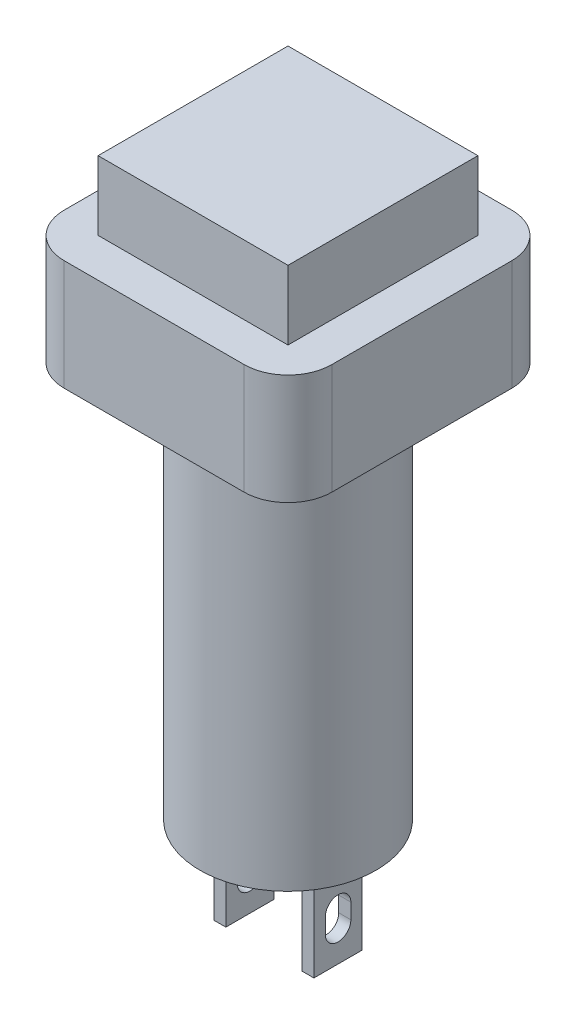
ISO-10303-21;
HEADER;
FILE_DESCRIPTION(('STEP AP214'),'2;1');
FILE_NAME('part.step','',(''),(''),'','','');
FILE_SCHEMA(('AUTOMOTIVE_DESIGN { 1 0 10303 214 1 1 1 1 }'));
ENDSEC;
DATA;
#1=APPLICATION_CONTEXT('core data for automotive mechanical design processes');
#2=APPLICATION_PROTOCOL_DEFINITION('international standard','automotive_design',2000,#1);
#3=PRODUCT_CONTEXT('',#1,'mechanical');
#4=PRODUCT('Part','Part','',(#3));
#5=PRODUCT_RELATED_PRODUCT_CATEGORY('part','',(#4));
#6=PRODUCT_DEFINITION_FORMATION('','',#4);
#7=PRODUCT_DEFINITION_CONTEXT('part definition',#1,'design');
#8=PRODUCT_DEFINITION('design','',#6,#7);
#9=PRODUCT_DEFINITION_SHAPE('','',#8);
#10=(LENGTH_UNIT() NAMED_UNIT(*) SI_UNIT(.MILLI.,.METRE.));
#11=(NAMED_UNIT(*) PLANE_ANGLE_UNIT() SI_UNIT($,.RADIAN.));
#12=(NAMED_UNIT(*) SI_UNIT($,.STERADIAN.) SOLID_ANGLE_UNIT());
#13=UNCERTAINTY_MEASURE_WITH_UNIT(LENGTH_MEASURE(1.E-05),#10,'distance_accuracy_value','');
#14=(GEOMETRIC_REPRESENTATION_CONTEXT(3) GLOBAL_UNCERTAINTY_ASSIGNED_CONTEXT((#13)) GLOBAL_UNIT_ASSIGNED_CONTEXT((#10,
#11,#12)) REPRESENTATION_CONTEXT('',''));
#15=CARTESIAN_POINT('',(0.,0.,0.));
#16=DIRECTION('',(0.,0.,1.));
#17=DIRECTION('',(1.,0.,0.));
#18=AXIS2_PLACEMENT_3D('',#15,#16,#17);
#19=CARTESIAN_POINT('',(7.75,-22.9,-7.75));
#20=DIRECTION('',(0.,-1.,0.));
#21=DIRECTION('',(0.,0.,-1.));
#22=AXIS2_PLACEMENT_3D('',#19,#20,#21);
#23=PLANE('',#22);
#24=CARTESIAN_POINT('',(7.75,-22.9,-7.75));
#25=DIRECTION('',(0.,-1.,0.));
#26=DIRECTION('',(0.,0.,-1.));
#27=AXIS2_PLACEMENT_3D('',#24,#25,#26);
#28=CIRCLE('',#27,5.1);
#29=CARTESIAN_POINT('',(7.75,-22.9,-12.85));
#30=VERTEX_POINT('',#29);
#31=EDGE_CURVE('E352',#30,#30,#28,.T.);
#32=ORIENTED_EDGE('',*,*,#31,.T.);
#33=EDGE_LOOP('',(#32));
#34=FACE_BOUND('',#33,.T.);
#35=DIRECTION('',(1.,0.,0.));
#36=VECTOR('',#35,1.);
#37=CARTESIAN_POINT('',(4.85,-22.9,-9.15));
#38=LINE('',#37,#36);
#39=CARTESIAN_POINT('',(4.85,-22.9,-9.15));
#40=VERTEX_POINT('',#39);
#41=CARTESIAN_POINT('',(5.55,-22.9,-9.15));
#42=VERTEX_POINT('',#41);
#43=EDGE_CURVE('E337',#40,#42,#38,.T.);
#44=ORIENTED_EDGE('',*,*,#43,.F.);
#45=DIRECTION('',(0.,0.,-1.));
#46=VECTOR('',#45,1.);
#47=CARTESIAN_POINT('',(4.85,-22.9,-6.35));
#48=LINE('',#47,#46);
#49=CARTESIAN_POINT('',(4.85,-22.9,-6.35));
#50=VERTEX_POINT('',#49);
#51=EDGE_CURVE('E323',#50,#40,#48,.T.);
#52=ORIENTED_EDGE('',*,*,#51,.F.);
#53=DIRECTION('',(-1.,0.,0.));
#54=VECTOR('',#53,1.);
#55=CARTESIAN_POINT('',(4.85,-22.9,-6.35));
#56=LINE('',#55,#54);
#57=CARTESIAN_POINT('',(5.55,-22.9,-6.35));
#58=VERTEX_POINT('',#57);
#59=EDGE_CURVE('E328',#58,#50,#56,.T.);
#60=ORIENTED_EDGE('',*,*,#59,.F.);
#61=DIRECTION('',(0.,0.,1.));
#62=VECTOR('',#61,1.);
#63=CARTESIAN_POINT('',(5.55,-22.9,-6.35));
#64=LINE('',#63,#62);
#65=EDGE_CURVE('E339',#42,#58,#64,.T.);
#66=ORIENTED_EDGE('',*,*,#65,.F.);
#67=EDGE_LOOP('',(#44,#52,#60,#66));
#68=FACE_BOUND('',#67,.T.);
#69=DIRECTION('',(1.,0.,0.));
#70=VECTOR('',#69,1.);
#71=CARTESIAN_POINT('',(9.95,-22.9,-9.15));
#72=LINE('',#71,#70);
#73=CARTESIAN_POINT('',(9.95,-22.9,-9.15));
#74=VERTEX_POINT('',#73);
#75=CARTESIAN_POINT('',(10.65,-22.9,-9.15));
#76=VERTEX_POINT('',#75);
#77=EDGE_CURVE('E308',#74,#76,#72,.T.);
#78=ORIENTED_EDGE('',*,*,#77,.F.);
#79=DIRECTION('',(0.,0.,-1.));
#80=VECTOR('',#79,1.);
#81=CARTESIAN_POINT('',(9.95,-22.9,-6.35));
#82=LINE('',#81,#80);
#83=CARTESIAN_POINT('',(9.95,-22.9,-6.35));
#84=VERTEX_POINT('',#83);
#85=EDGE_CURVE('E294',#84,#74,#82,.T.);
#86=ORIENTED_EDGE('',*,*,#85,.F.);
#87=DIRECTION('',(-1.,0.,0.));
#88=VECTOR('',#87,1.);
#89=CARTESIAN_POINT('',(9.95,-22.9,-6.35));
#90=LINE('',#89,#88);
#91=CARTESIAN_POINT('',(10.65,-22.9,-6.35));
#92=VERTEX_POINT('',#91);
#93=EDGE_CURVE('E299',#92,#84,#90,.T.);
#94=ORIENTED_EDGE('',*,*,#93,.F.);
#95=DIRECTION('',(0.,0.,1.));
#96=VECTOR('',#95,1.);
#97=CARTESIAN_POINT('',(10.65,-22.9,-6.35));
#98=LINE('',#97,#96);
#99=EDGE_CURVE('E310',#76,#92,#98,.T.);
#100=ORIENTED_EDGE('',*,*,#99,.F.);
#101=EDGE_LOOP('',(#78,#86,#94,#100));
#102=FACE_BOUND('',#101,.T.);
#103=ADVANCED_FACE('F39',(#34,#68,#102),#23,.T.);
#104=CARTESIAN_POINT('',(0.,6.4,0.));
#105=DIRECTION('',(0.,-1.,0.));
#106=DIRECTION('',(0.,0.,-1.));
#107=AXIS2_PLACEMENT_3D('',#104,#105,#106);
#108=PLANE('',#107);
#109=DIRECTION('',(-1.,0.,0.));
#110=VECTOR('',#109,1.);
#111=CARTESIAN_POINT('',(0.,6.4,-15.5));
#112=LINE('',#111,#110);
#113=CARTESIAN_POINT('',(12.96,6.4,-15.5));
#114=VERTEX_POINT('',#113);
#115=CARTESIAN_POINT('',(2.54,6.4,-15.5));
#116=VERTEX_POINT('',#115);
#117=EDGE_CURVE('E397',#114,#116,#112,.T.);
#118=ORIENTED_EDGE('',*,*,#117,.T.);
#119=CARTESIAN_POINT('',(2.54,6.4,-12.96));
#120=DIRECTION('',(0.,-1.,0.));
#121=DIRECTION('',(0.,0.,-1.));
#122=AXIS2_PLACEMENT_3D('',#119,#120,#121);
#123=CIRCLE('',#122,2.54);
#124=CARTESIAN_POINT('',(0.,6.4,-12.96));
#125=VERTEX_POINT('',#124);
#126=EDGE_CURVE('E43',#116,#125,#123,.F.);
#127=ORIENTED_EDGE('',*,*,#126,.T.);
#128=DIRECTION('',(0.,0.,1.));
#129=VECTOR('',#128,1.);
#130=CARTESIAN_POINT('',(0.,6.4,0.));
#131=LINE('',#130,#129);
#132=CARTESIAN_POINT('',(0.,6.4,-2.54));
#133=VERTEX_POINT('',#132);
#134=EDGE_CURVE('E389',#125,#133,#131,.T.);
#135=ORIENTED_EDGE('',*,*,#134,.T.);
#136=CARTESIAN_POINT('',(2.54,6.4,-2.54));
#137=DIRECTION('',(0.,-1.,0.));
#138=DIRECTION('',(0.,0.,-1.));
#139=AXIS2_PLACEMENT_3D('',#136,#137,#138);
#140=CIRCLE('',#139,2.54);
#141=CARTESIAN_POINT('',(2.54,6.4,0.));
#142=VERTEX_POINT('',#141);
#143=EDGE_CURVE('E428',#133,#142,#140,.F.);
#144=ORIENTED_EDGE('',*,*,#143,.T.);
#145=DIRECTION('',(1.,0.,0.));
#146=VECTOR('',#145,1.);
#147=CARTESIAN_POINT('',(0.,6.4,0.));
#148=LINE('',#147,#146);
#149=CARTESIAN_POINT('',(12.96,6.4,0.));
#150=VERTEX_POINT('',#149);
#151=EDGE_CURVE('E391',#142,#150,#148,.T.);
#152=ORIENTED_EDGE('',*,*,#151,.T.);
#153=CARTESIAN_POINT('',(12.96,6.4,-2.54));
#154=DIRECTION('',(0.,-1.,0.));
#155=DIRECTION('',(0.,0.,-1.));
#156=AXIS2_PLACEMENT_3D('',#153,#154,#155);
#157=CIRCLE('',#156,2.54);
#158=CARTESIAN_POINT('',(15.5,6.4,-2.54));
#159=VERTEX_POINT('',#158);
#160=EDGE_CURVE('E417',#150,#159,#157,.F.);
#161=ORIENTED_EDGE('',*,*,#160,.T.);
#162=DIRECTION('',(0.,0.,-1.));
#163=VECTOR('',#162,1.);
#164=CARTESIAN_POINT('',(15.5,6.4,0.));
#165=LINE('',#164,#163);
#166=CARTESIAN_POINT('',(15.5,6.4,-12.96));
#167=VERTEX_POINT('',#166);
#168=EDGE_CURVE('E394',#159,#167,#165,.T.);
#169=ORIENTED_EDGE('',*,*,#168,.T.);
#170=CARTESIAN_POINT('',(12.96,6.4,-12.96));
#171=DIRECTION('',(0.,-1.,0.));
#172=DIRECTION('',(0.,0.,-1.));
#173=AXIS2_PLACEMENT_3D('',#170,#171,#172);
#174=CIRCLE('',#173,2.54);
#175=EDGE_CURVE('E437',#167,#114,#174,.F.);
#176=ORIENTED_EDGE('',*,*,#175,.T.);
#177=EDGE_LOOP('',(#118,#127,#135,#144,#152,#161,#169,#176));
#178=FACE_BOUND('',#177,.T.);
#179=DIRECTION('',(0.,0.,1.));
#180=VECTOR('',#179,1.);
#181=CARTESIAN_POINT('',(2.25,6.4,-13.25));
#182=LINE('',#181,#180);
#183=CARTESIAN_POINT('',(2.25,6.4,-13.25));
#184=VERTEX_POINT('',#183);
#185=CARTESIAN_POINT('',(2.25,6.4,-2.25));
#186=VERTEX_POINT('',#185);
#187=EDGE_CURVE('E354',#184,#186,#182,.T.);
#188=ORIENTED_EDGE('',*,*,#187,.F.);
#189=DIRECTION('',(-1.,0.,0.));
#190=VECTOR('',#189,1.);
#191=CARTESIAN_POINT('',(2.25,6.4,-13.25));
#192=LINE('',#191,#190);
#193=CARTESIAN_POINT('',(13.25,6.4,-13.25));
#194=VERTEX_POINT('',#193);
#195=EDGE_CURVE('E360',#194,#184,#192,.T.);
#196=ORIENTED_EDGE('',*,*,#195,.F.);
#197=DIRECTION('',(0.,0.,-1.));
#198=VECTOR('',#197,1.);
#199=CARTESIAN_POINT('',(13.25,6.4,-13.25));
#200=LINE('',#199,#198);
#201=CARTESIAN_POINT('',(13.25,6.4,-2.25));
#202=VERTEX_POINT('',#201);
#203=EDGE_CURVE('E372',#202,#194,#200,.T.);
#204=ORIENTED_EDGE('',*,*,#203,.F.);
#205=DIRECTION('',(1.,0.,0.));
#206=VECTOR('',#205,1.);
#207=CARTESIAN_POINT('',(2.25,6.4,-2.25));
#208=LINE('',#207,#206);
#209=EDGE_CURVE('E369',#186,#202,#208,.T.);
#210=ORIENTED_EDGE('',*,*,#209,.F.);
#211=EDGE_LOOP('',(#188,#196,#204,#210));
#212=FACE_BOUND('',#211,.T.);
#213=ADVANCED_FACE('F450',(#178,#212),#108,.F.);
#214=CARTESIAN_POINT('',(0.,6.4,0.));
#215=DIRECTION('',(1.,0.,0.));
#216=DIRECTION('',(0.,0.,-1.));
#217=AXIS2_PLACEMENT_3D('',#214,#215,#216);
#218=PLANE('',#217);
#219=ORIENTED_EDGE('',*,*,#134,.F.);
#220=DIRECTION('',(0.,-1.,0.));
#221=VECTOR('',#220,1.);
#222=CARTESIAN_POINT('',(0.,6.4,-12.96));
#223=LINE('',#222,#221);
#224=CARTESIAN_POINT('',(0.,0.,-12.96));
#225=VERTEX_POINT('',#224);
#226=EDGE_CURVE('E439',#125,#225,#223,.T.);
#227=ORIENTED_EDGE('',*,*,#226,.T.);
#228=DIRECTION('',(0.,0.,1.));
#229=VECTOR('',#228,1.);
#230=CARTESIAN_POINT('',(0.,0.,0.));
#231=LINE('',#230,#229);
#232=CARTESIAN_POINT('',(0.,0.,-2.54));
#233=VERTEX_POINT('',#232);
#234=EDGE_CURVE('E388',#225,#233,#231,.T.);
#235=ORIENTED_EDGE('',*,*,#234,.T.);
#236=DIRECTION('',(0.,-1.,0.));
#237=VECTOR('',#236,1.);
#238=CARTESIAN_POINT('',(0.,6.4,-2.54));
#239=LINE('',#238,#237);
#240=EDGE_CURVE('E425',#233,#133,#239,.F.);
#241=ORIENTED_EDGE('',*,*,#240,.T.);
#242=EDGE_LOOP('',(#219,#227,#235,#241));
#243=FACE_BOUND('',#242,.T.);
#244=ADVANCED_FACE('F455',(#243),#218,.F.);
#245=CARTESIAN_POINT('',(0.,6.4,0.));
#246=DIRECTION('',(0.,0.,-1.));
#247=DIRECTION('',(-1.,0.,0.));
#248=AXIS2_PLACEMENT_3D('',#245,#246,#247);
#249=PLANE('',#248);
#250=ORIENTED_EDGE('',*,*,#151,.F.);
#251=DIRECTION('',(0.,-1.,0.));
#252=VECTOR('',#251,1.);
#253=CARTESIAN_POINT('',(2.54,6.4,0.));
#254=LINE('',#253,#252);
#255=CARTESIAN_POINT('',(2.54,0.,0.));
#256=VERTEX_POINT('',#255);
#257=EDGE_CURVE('E419',#142,#256,#254,.T.);
#258=ORIENTED_EDGE('',*,*,#257,.T.);
#259=DIRECTION('',(1.,0.,0.));
#260=VECTOR('',#259,1.);
#261=CARTESIAN_POINT('',(0.,0.,0.));
#262=LINE('',#261,#260);
#263=CARTESIAN_POINT('',(12.96,0.,0.));
#264=VERTEX_POINT('',#263);
#265=EDGE_CURVE('E402',#256,#264,#262,.T.);
#266=ORIENTED_EDGE('',*,*,#265,.T.);
#267=DIRECTION('',(0.,-1.,0.));
#268=VECTOR('',#267,1.);
#269=CARTESIAN_POINT('',(12.96,6.4,0.));
#270=LINE('',#269,#268);
#271=EDGE_CURVE('E414',#264,#150,#270,.F.);
#272=ORIENTED_EDGE('',*,*,#271,.T.);
#273=EDGE_LOOP('',(#250,#258,#266,#272));
#274=FACE_BOUND('',#273,.T.);
#275=ADVANCED_FACE('F480',(#274),#249,.F.);
#276=CARTESIAN_POINT('',(15.5,6.4,0.));
#277=DIRECTION('',(-1.,0.,0.));
#278=DIRECTION('',(0.,0.,1.));
#279=AXIS2_PLACEMENT_3D('',#276,#277,#278);
#280=PLANE('',#279);
#281=DIRECTION('',(0.,0.,-1.));
#282=VECTOR('',#281,1.);
#283=CARTESIAN_POINT('',(15.5,0.,0.));
#284=LINE('',#283,#282);
#285=CARTESIAN_POINT('',(15.5,0.,-2.54));
#286=VERTEX_POINT('',#285);
#287=CARTESIAN_POINT('',(15.5,0.,-12.96));
#288=VERTEX_POINT('',#287);
#289=EDGE_CURVE('E404',#286,#288,#284,.T.);
#290=ORIENTED_EDGE('',*,*,#289,.T.);
#291=DIRECTION('',(0.,-1.,0.));
#292=VECTOR('',#291,1.);
#293=CARTESIAN_POINT('',(15.5,6.4,-12.96));
#294=LINE('',#293,#292);
#295=EDGE_CURVE('E435',#288,#167,#294,.F.);
#296=ORIENTED_EDGE('',*,*,#295,.T.);
#297=ORIENTED_EDGE('',*,*,#168,.F.);
#298=DIRECTION('',(0.,-1.,0.));
#299=VECTOR('',#298,1.);
#300=CARTESIAN_POINT('',(15.5,6.4,-2.54));
#301=LINE('',#300,#299);
#302=EDGE_CURVE('E400',#159,#286,#301,.T.);
#303=ORIENTED_EDGE('',*,*,#302,.T.);
#304=EDGE_LOOP('',(#290,#296,#297,#303));
#305=FACE_BOUND('',#304,.T.);
#306=ADVANCED_FACE('F470',(#305),#280,.F.);
#307=CARTESIAN_POINT('',(0.,6.4,-15.5));
#308=DIRECTION('',(0.,0.,1.));
#309=DIRECTION('',(1.,0.,0.));
#310=AXIS2_PLACEMENT_3D('',#307,#308,#309);
#311=PLANE('',#310);
#312=DIRECTION('',(-1.,0.,0.));
#313=VECTOR('',#312,1.);
#314=CARTESIAN_POINT('',(0.,0.,-15.5));
#315=LINE('',#314,#313);
#316=CARTESIAN_POINT('',(12.96,0.,-15.5));
#317=VERTEX_POINT('',#316);
#318=CARTESIAN_POINT('',(2.54,0.,-15.5));
#319=VERTEX_POINT('',#318);
#320=EDGE_CURVE('E392',#317,#319,#315,.T.);
#321=ORIENTED_EDGE('',*,*,#320,.T.);
#322=DIRECTION('',(0.,-1.,0.));
#323=VECTOR('',#322,1.);
#324=CARTESIAN_POINT('',(2.54,6.4,-15.5));
#325=LINE('',#324,#323);
#326=EDGE_CURVE('E443',#319,#116,#325,.F.);
#327=ORIENTED_EDGE('',*,*,#326,.T.);
#328=ORIENTED_EDGE('',*,*,#117,.F.);
#329=DIRECTION('',(0.,-1.,0.));
#330=VECTOR('',#329,1.);
#331=CARTESIAN_POINT('',(12.96,6.4,-15.5));
#332=LINE('',#331,#330);
#333=EDGE_CURVE('E430',#114,#317,#332,.T.);
#334=ORIENTED_EDGE('',*,*,#333,.T.);
#335=EDGE_LOOP('',(#321,#327,#328,#334));
#336=FACE_BOUND('',#335,.T.);
#337=ADVANCED_FACE('F462',(#336),#311,.F.);
#338=CARTESIAN_POINT('',(0.,0.,0.));
#339=DIRECTION('',(0.,-1.,0.));
#340=DIRECTION('',(0.,0.,-1.));
#341=AXIS2_PLACEMENT_3D('',#338,#339,#340);
#342=PLANE('',#341);
#343=CARTESIAN_POINT('',(7.75,0.,-7.75));
#344=DIRECTION('',(0.,-1.,0.));
#345=DIRECTION('',(0.,0.,-1.));
#346=AXIS2_PLACEMENT_3D('',#343,#344,#345);
#347=CIRCLE('',#346,5.1);
#348=CARTESIAN_POINT('',(7.75,0.,-12.85));
#349=VERTEX_POINT('',#348);
#350=EDGE_CURVE('E11',#349,#349,#347,.T.);
#351=ORIENTED_EDGE('',*,*,#350,.F.);
#352=EDGE_LOOP('',(#351));
#353=FACE_BOUND('',#352,.T.);
#354=ORIENTED_EDGE('',*,*,#234,.F.);
#355=CARTESIAN_POINT('',(2.54,0.,-12.96));
#356=DIRECTION('',(0.,-1.,0.));
#357=DIRECTION('',(0.,0.,-1.));
#358=AXIS2_PLACEMENT_3D('',#355,#356,#357);
#359=CIRCLE('',#358,2.54);
#360=EDGE_CURVE('E442',#225,#319,#359,.T.);
#361=ORIENTED_EDGE('',*,*,#360,.T.);
#362=ORIENTED_EDGE('',*,*,#320,.F.);
#363=CARTESIAN_POINT('',(12.96,0.,-12.96));
#364=DIRECTION('',(0.,-1.,0.));
#365=DIRECTION('',(0.,0.,-1.));
#366=AXIS2_PLACEMENT_3D('',#363,#364,#365);
#367=CIRCLE('',#366,2.54);
#368=EDGE_CURVE('E433',#317,#288,#367,.T.);
#369=ORIENTED_EDGE('',*,*,#368,.T.);
#370=ORIENTED_EDGE('',*,*,#289,.F.);
#371=CARTESIAN_POINT('',(12.96,0.,-2.54));
#372=DIRECTION('',(0.,-1.,0.));
#373=DIRECTION('',(0.,0.,-1.));
#374=AXIS2_PLACEMENT_3D('',#371,#372,#373);
#375=CIRCLE('',#374,2.54);
#376=EDGE_CURVE('E411',#286,#264,#375,.T.);
#377=ORIENTED_EDGE('',*,*,#376,.T.);
#378=ORIENTED_EDGE('',*,*,#265,.F.);
#379=CARTESIAN_POINT('',(2.54,0.,-2.54));
#380=DIRECTION('',(0.,-1.,0.));
#381=DIRECTION('',(0.,0.,-1.));
#382=AXIS2_PLACEMENT_3D('',#379,#380,#381);
#383=CIRCLE('',#382,2.54);
#384=EDGE_CURVE('E422',#256,#233,#383,.T.);
#385=ORIENTED_EDGE('',*,*,#384,.T.);
#386=EDGE_LOOP('',(#354,#361,#362,#369,#370,#377,#378,#385));
#387=FACE_BOUND('',#386,.T.);
#388=ADVANCED_FACE('F461',(#353,#387),#342,.T.);
#389=CARTESIAN_POINT('',(12.96,6.4,-2.54));
#390=DIRECTION('',(0.,-1.,0.));
#391=DIRECTION('',(0.,0.,-1.));
#392=AXIS2_PLACEMENT_3D('',#389,#390,#391);
#393=CYLINDRICAL_SURFACE('',#392,2.54);
#394=ORIENTED_EDGE('',*,*,#160,.F.);
#395=ORIENTED_EDGE('',*,*,#271,.F.);
#396=ORIENTED_EDGE('',*,*,#376,.F.);
#397=ORIENTED_EDGE('',*,*,#302,.F.);
#398=EDGE_LOOP('',(#394,#395,#396,#397));
#399=FACE_BOUND('',#398,.T.);
#400=ADVANCED_FACE('F475',(#399),#393,.T.);
#401=CARTESIAN_POINT('',(2.54,6.4,-2.54));
#402=DIRECTION('',(0.,-1.,0.));
#403=DIRECTION('',(0.,0.,-1.));
#404=AXIS2_PLACEMENT_3D('',#401,#402,#403);
#405=CYLINDRICAL_SURFACE('',#404,2.54);
#406=ORIENTED_EDGE('',*,*,#143,.F.);
#407=ORIENTED_EDGE('',*,*,#240,.F.);
#408=ORIENTED_EDGE('',*,*,#384,.F.);
#409=ORIENTED_EDGE('',*,*,#257,.F.);
#410=EDGE_LOOP('',(#406,#407,#408,#409));
#411=FACE_BOUND('',#410,.T.);
#412=ADVANCED_FACE('F483',(#411),#405,.T.);
#413=CARTESIAN_POINT('',(12.96,6.4,-12.96));
#414=DIRECTION('',(0.,-1.,0.));
#415=DIRECTION('',(0.,0.,-1.));
#416=AXIS2_PLACEMENT_3D('',#413,#414,#415);
#417=CYLINDRICAL_SURFACE('',#416,2.54);
#418=ORIENTED_EDGE('',*,*,#175,.F.);
#419=ORIENTED_EDGE('',*,*,#295,.F.);
#420=ORIENTED_EDGE('',*,*,#368,.F.);
#421=ORIENTED_EDGE('',*,*,#333,.F.);
#422=EDGE_LOOP('',(#418,#419,#420,#421));
#423=FACE_BOUND('',#422,.T.);
#424=ADVANCED_FACE('F466',(#423),#417,.T.);
#425=CARTESIAN_POINT('',(2.54,6.4,-12.96));
#426=DIRECTION('',(0.,-1.,0.));
#427=DIRECTION('',(0.,0.,-1.));
#428=AXIS2_PLACEMENT_3D('',#425,#426,#427);
#429=CYLINDRICAL_SURFACE('',#428,2.54);
#430=ORIENTED_EDGE('',*,*,#126,.F.);
#431=ORIENTED_EDGE('',*,*,#326,.F.);
#432=ORIENTED_EDGE('',*,*,#360,.F.);
#433=ORIENTED_EDGE('',*,*,#226,.F.);
#434=EDGE_LOOP('',(#430,#431,#432,#433));
#435=FACE_BOUND('',#434,.T.);
#436=ADVANCED_FACE('F41',(#435),#429,.T.);
#437=CARTESIAN_POINT('',(2.25,10.4,-13.25));
#438=DIRECTION('',(1.,0.,0.));
#439=DIRECTION('',(0.,0.,-1.));
#440=AXIS2_PLACEMENT_3D('',#437,#438,#439);
#441=PLANE('',#440);
#442=ORIENTED_EDGE('',*,*,#187,.T.);
#443=DIRECTION('',(0.,-1.,0.));
#444=VECTOR('',#443,1.);
#445=CARTESIAN_POINT('',(2.25,10.4,-2.25));
#446=LINE('',#445,#444);
#447=CARTESIAN_POINT('',(2.25,10.4,-2.25));
#448=VERTEX_POINT('',#447);
#449=EDGE_CURVE('E385',#448,#186,#446,.T.);
#450=ORIENTED_EDGE('',*,*,#449,.F.);
#451=DIRECTION('',(0.,0.,1.));
#452=VECTOR('',#451,1.);
#453=CARTESIAN_POINT('',(2.25,10.4,-13.25));
#454=LINE('',#453,#452);
#455=CARTESIAN_POINT('',(2.25,10.4,-13.25));
#456=VERTEX_POINT('',#455);
#457=EDGE_CURVE('E356',#456,#448,#454,.T.);
#458=ORIENTED_EDGE('',*,*,#457,.F.);
#459=DIRECTION('',(0.,-1.,0.));
#460=VECTOR('',#459,1.);
#461=CARTESIAN_POINT('',(2.25,10.4,-13.25));
#462=LINE('',#461,#460);
#463=EDGE_CURVE('E366',#456,#184,#462,.T.);
#464=ORIENTED_EDGE('',*,*,#463,.T.);
#465=EDGE_LOOP('',(#442,#450,#458,#464));
#466=FACE_BOUND('',#465,.T.);
#467=ADVANCED_FACE('F522',(#466),#441,.F.);
#468=CARTESIAN_POINT('',(2.25,10.4,-2.25));
#469=DIRECTION('',(0.,0.,-1.));
#470=DIRECTION('',(-1.,0.,0.));
#471=AXIS2_PLACEMENT_3D('',#468,#469,#470);
#472=PLANE('',#471);
#473=ORIENTED_EDGE('',*,*,#209,.T.);
#474=DIRECTION('',(0.,-1.,0.));
#475=VECTOR('',#474,1.);
#476=CARTESIAN_POINT('',(13.25,10.4,-2.25));
#477=LINE('',#476,#475);
#478=CARTESIAN_POINT('',(13.25,10.4,-2.25));
#479=VERTEX_POINT('',#478);
#480=EDGE_CURVE('E382',#479,#202,#477,.T.);
#481=ORIENTED_EDGE('',*,*,#480,.F.);
#482=DIRECTION('',(1.,0.,0.));
#483=VECTOR('',#482,1.);
#484=CARTESIAN_POINT('',(2.25,10.4,-2.25));
#485=LINE('',#484,#483);
#486=EDGE_CURVE('E359',#448,#479,#485,.T.);
#487=ORIENTED_EDGE('',*,*,#486,.F.);
#488=ORIENTED_EDGE('',*,*,#449,.T.);
#489=EDGE_LOOP('',(#473,#481,#487,#488));
#490=FACE_BOUND('',#489,.T.);
#491=ADVANCED_FACE('F518',(#490),#472,.F.);
#492=CARTESIAN_POINT('',(13.25,10.4,-13.25));
#493=DIRECTION('',(-1.,0.,0.));
#494=DIRECTION('',(0.,0.,1.));
#495=AXIS2_PLACEMENT_3D('',#492,#493,#494);
#496=PLANE('',#495);
#497=ORIENTED_EDGE('',*,*,#203,.T.);
#498=DIRECTION('',(0.,-1.,0.));
#499=VECTOR('',#498,1.);
#500=CARTESIAN_POINT('',(13.25,10.4,-13.25));
#501=LINE('',#500,#499);
#502=CARTESIAN_POINT('',(13.25,10.4,-13.25));
#503=VERTEX_POINT('',#502);
#504=EDGE_CURVE('E379',#503,#194,#501,.T.);
#505=ORIENTED_EDGE('',*,*,#504,.F.);
#506=DIRECTION('',(0.,0.,-1.));
#507=VECTOR('',#506,1.);
#508=CARTESIAN_POINT('',(13.25,10.4,-13.25));
#509=LINE('',#508,#507);
#510=EDGE_CURVE('E362',#479,#503,#509,.T.);
#511=ORIENTED_EDGE('',*,*,#510,.F.);
#512=ORIENTED_EDGE('',*,*,#480,.T.);
#513=EDGE_LOOP('',(#497,#505,#511,#512));
#514=FACE_BOUND('',#513,.T.);
#515=ADVANCED_FACE('F514',(#514),#496,.F.);
#516=CARTESIAN_POINT('',(2.25,10.4,-13.25));
#517=DIRECTION('',(0.,0.,1.));
#518=DIRECTION('',(1.,0.,0.));
#519=AXIS2_PLACEMENT_3D('',#516,#517,#518);
#520=PLANE('',#519);
#521=ORIENTED_EDGE('',*,*,#195,.T.);
#522=ORIENTED_EDGE('',*,*,#463,.F.);
#523=DIRECTION('',(-1.,0.,0.));
#524=VECTOR('',#523,1.);
#525=CARTESIAN_POINT('',(2.25,10.4,-13.25));
#526=LINE('',#525,#524);
#527=EDGE_CURVE('E364',#503,#456,#526,.T.);
#528=ORIENTED_EDGE('',*,*,#527,.F.);
#529=ORIENTED_EDGE('',*,*,#504,.T.);
#530=EDGE_LOOP('',(#521,#522,#528,#529));
#531=FACE_BOUND('',#530,.T.);
#532=ADVANCED_FACE('F510',(#531),#520,.F.);
#533=CARTESIAN_POINT('',(0.,10.4,0.));
#534=DIRECTION('',(0.,1.,0.));
#535=DIRECTION('',(0.,0.,1.));
#536=AXIS2_PLACEMENT_3D('',#533,#534,#535);
#537=PLANE('',#536);
#538=ORIENTED_EDGE('',*,*,#457,.T.);
#539=ORIENTED_EDGE('',*,*,#486,.T.);
#540=ORIENTED_EDGE('',*,*,#510,.T.);
#541=ORIENTED_EDGE('',*,*,#527,.T.);
#542=EDGE_LOOP('',(#538,#539,#540,#541));
#543=FACE_BOUND('',#542,.T.);
#544=ADVANCED_FACE('F506',(#543),#537,.T.);
#545=CARTESIAN_POINT('',(7.75,-22.9,-7.75));
#546=DIRECTION('',(0.,1.,0.));
#547=DIRECTION('',(0.,0.,1.));
#548=AXIS2_PLACEMENT_3D('',#545,#546,#547);
#549=CYLINDRICAL_SURFACE('',#548,5.1);
#550=ORIENTED_EDGE('',*,*,#31,.F.);
#551=EDGE_LOOP('',(#550));
#552=FACE_BOUND('',#551,.T.);
#553=ORIENTED_EDGE('',*,*,#350,.T.);
#554=EDGE_LOOP('',(#553));
#555=FACE_BOUND('',#554,.T.);
#556=ADVANCED_FACE('F503',(#552,#555),#549,.T.);
#557=CARTESIAN_POINT('',(4.85,-28.7,-6.35));
#558=DIRECTION('',(1.,0.,0.));
#559=DIRECTION('',(0.,0.,-1.));
#560=AXIS2_PLACEMENT_3D('',#557,#558,#559);
#561=PLANE('',#560);
#562=DIRECTION('',(0.,1.,0.));
#563=VECTOR('',#562,1.);
#564=CARTESIAN_POINT('',(4.85,-28.7,-8.48923579721127));
#565=LINE('',#564,#563);
#566=CARTESIAN_POINT('',(4.85,-26.8484882654011,-8.48923579721127));
#567=VERTEX_POINT('',#566);
#568=CARTESIAN_POINT('',(4.85,-25.9629746190201,-8.48923579721127));
#569=VERTEX_POINT('',#568);
#570=EDGE_CURVE('E282',#567,#569,#565,.T.);
#571=ORIENTED_EDGE('',*,*,#570,.T.);
#572=CARTESIAN_POINT('',(4.85,-25.9629746190201,-7.75));
#573=DIRECTION('',(1.,0.,0.));
#574=DIRECTION('',(0.,0.,-1.));
#575=AXIS2_PLACEMENT_3D('',#572,#573,#574);
#576=CIRCLE('',#575,0.739235797211268);
#577=CARTESIAN_POINT('',(4.85,-25.9629746190201,-7.01076420278873));
#578=VERTEX_POINT('',#577);
#579=EDGE_CURVE('E291',#569,#578,#576,.T.);
#580=ORIENTED_EDGE('',*,*,#579,.T.);
#581=DIRECTION('',(0.,-1.,0.));
#582=VECTOR('',#581,1.);
#583=CARTESIAN_POINT('',(4.85,-28.7,-7.01076420278873));
#584=LINE('',#583,#582);
#585=CARTESIAN_POINT('',(4.85,-26.8484882654011,-7.01076420278873));
#586=VERTEX_POINT('',#585);
#587=EDGE_CURVE('E266',#578,#586,#584,.T.);
#588=ORIENTED_EDGE('',*,*,#587,.T.);
#589=CARTESIAN_POINT('',(4.85,-26.8484882654011,-7.75));
#590=DIRECTION('',(1.,0.,0.));
#591=DIRECTION('',(0.,0.,-1.));
#592=AXIS2_PLACEMENT_3D('',#589,#590,#591);
#593=CIRCLE('',#592,0.739235797211268);
#594=EDGE_CURVE('E273',#586,#567,#593,.T.);
#595=ORIENTED_EDGE('',*,*,#594,.T.);
#596=EDGE_LOOP('',(#571,#580,#588,#595));
#597=FACE_BOUND('',#596,.T.);
#598=ORIENTED_EDGE('',*,*,#51,.T.);
#599=DIRECTION('',(0.,1.,0.));
#600=VECTOR('',#599,1.);
#601=CARTESIAN_POINT('',(4.85,-28.7,-9.15));
#602=LINE('',#601,#600);
#603=CARTESIAN_POINT('',(4.85,-28.7,-9.15));
#604=VERTEX_POINT('',#603);
#605=EDGE_CURVE('E350',#604,#40,#602,.T.);
#606=ORIENTED_EDGE('',*,*,#605,.F.);
#607=DIRECTION('',(0.,0.,-1.));
#608=VECTOR('',#607,1.);
#609=CARTESIAN_POINT('',(4.85,-28.7,-6.35));
#610=LINE('',#609,#608);
#611=CARTESIAN_POINT('',(4.85,-28.7,-6.35));
#612=VERTEX_POINT('',#611);
#613=EDGE_CURVE('E324',#612,#604,#610,.T.);
#614=ORIENTED_EDGE('',*,*,#613,.F.);
#615=DIRECTION('',(0.,1.,0.));
#616=VECTOR('',#615,1.);
#617=CARTESIAN_POINT('',(4.85,-28.7,-6.35));
#618=LINE('',#617,#616);
#619=EDGE_CURVE('E334',#612,#50,#618,.T.);
#620=ORIENTED_EDGE('',*,*,#619,.T.);
#621=EDGE_LOOP('',(#598,#606,#614,#620));
#622=FACE_BOUND('',#621,.T.);
#623=ADVANCED_FACE('F501',(#597,#622),#561,.F.);
#624=CARTESIAN_POINT('',(4.85,-28.7,-9.15));
#625=DIRECTION('',(0.,0.,1.));
#626=DIRECTION('',(1.,0.,0.));
#627=AXIS2_PLACEMENT_3D('',#624,#625,#626);
#628=PLANE('',#627);
#629=ORIENTED_EDGE('',*,*,#43,.T.);
#630=DIRECTION('',(0.,1.,0.));
#631=VECTOR('',#630,1.);
#632=CARTESIAN_POINT('',(5.55,-28.7,-9.15));
#633=LINE('',#632,#631);
#634=CARTESIAN_POINT('',(5.55,-28.7,-9.15));
#635=VERTEX_POINT('',#634);
#636=EDGE_CURVE('E347',#635,#42,#633,.T.);
#637=ORIENTED_EDGE('',*,*,#636,.F.);
#638=DIRECTION('',(1.,0.,0.));
#639=VECTOR('',#638,1.);
#640=CARTESIAN_POINT('',(4.85,-28.7,-9.15));
#641=LINE('',#640,#639);
#642=EDGE_CURVE('E327',#604,#635,#641,.T.);
#643=ORIENTED_EDGE('',*,*,#642,.F.);
#644=ORIENTED_EDGE('',*,*,#605,.T.);
#645=EDGE_LOOP('',(#629,#637,#643,#644));
#646=FACE_BOUND('',#645,.T.);
#647=ADVANCED_FACE('F628',(#646),#628,.F.);
#648=CARTESIAN_POINT('',(5.55,-28.7,-6.35));
#649=DIRECTION('',(-1.,0.,0.));
#650=DIRECTION('',(0.,0.,1.));
#651=AXIS2_PLACEMENT_3D('',#648,#649,#650);
#652=PLANE('',#651);
#653=DIRECTION('',(0.,1.,0.));
#654=VECTOR('',#653,1.);
#655=CARTESIAN_POINT('',(5.55,-28.7,-7.01076420278873));
#656=LINE('',#655,#654);
#657=CARTESIAN_POINT('',(5.55,-26.8484882654011,-7.01076420278873));
#658=VERTEX_POINT('',#657);
#659=CARTESIAN_POINT('',(5.55,-25.9629746190201,-7.01076420278873));
#660=VERTEX_POINT('',#659);
#661=EDGE_CURVE('E263',#658,#660,#656,.T.);
#662=ORIENTED_EDGE('',*,*,#661,.T.);
#663=CARTESIAN_POINT('',(5.55,-25.9629746190201,-7.75));
#664=DIRECTION('',(-1.,0.,0.));
#665=DIRECTION('',(0.,0.,1.));
#666=AXIS2_PLACEMENT_3D('',#663,#664,#665);
#667=CIRCLE('',#666,0.739235797211268);
#668=CARTESIAN_POINT('',(5.55,-25.9629746190201,-8.48923579721127));
#669=VERTEX_POINT('',#668);
#670=EDGE_CURVE('E288',#660,#669,#667,.T.);
#671=ORIENTED_EDGE('',*,*,#670,.T.);
#672=DIRECTION('',(0.,-1.,0.));
#673=VECTOR('',#672,1.);
#674=CARTESIAN_POINT('',(5.55,-28.7,-8.48923579721127));
#675=LINE('',#674,#673);
#676=CARTESIAN_POINT('',(5.55,-26.8484882654011,-8.48923579721127));
#677=VERTEX_POINT('',#676);
#678=EDGE_CURVE('E279',#669,#677,#675,.T.);
#679=ORIENTED_EDGE('',*,*,#678,.T.);
#680=CARTESIAN_POINT('',(5.55,-26.8484882654011,-7.75));
#681=DIRECTION('',(-1.,0.,0.));
#682=DIRECTION('',(0.,0.,1.));
#683=AXIS2_PLACEMENT_3D('',#680,#681,#682);
#684=CIRCLE('',#683,0.739235797211268);
#685=EDGE_CURVE('E270',#677,#658,#684,.T.);
#686=ORIENTED_EDGE('',*,*,#685,.T.);
#687=EDGE_LOOP('',(#662,#671,#679,#686));
#688=FACE_BOUND('',#687,.T.);
#689=ORIENTED_EDGE('',*,*,#65,.T.);
#690=DIRECTION('',(0.,1.,0.));
#691=VECTOR('',#690,1.);
#692=CARTESIAN_POINT('',(5.55,-28.7,-6.35));
#693=LINE('',#692,#691);
#694=CARTESIAN_POINT('',(5.55,-28.7,-6.35));
#695=VERTEX_POINT('',#694);
#696=EDGE_CURVE('E345',#695,#58,#693,.T.);
#697=ORIENTED_EDGE('',*,*,#696,.F.);
#698=DIRECTION('',(0.,0.,1.));
#699=VECTOR('',#698,1.);
#700=CARTESIAN_POINT('',(5.55,-28.7,-6.35));
#701=LINE('',#700,#699);
#702=EDGE_CURVE('E330',#635,#695,#701,.T.);
#703=ORIENTED_EDGE('',*,*,#702,.F.);
#704=ORIENTED_EDGE('',*,*,#636,.T.);
#705=EDGE_LOOP('',(#689,#697,#703,#704));
#706=FACE_BOUND('',#705,.T.);
#707=ADVANCED_FACE('F633',(#688,#706),#652,.F.);
#708=CARTESIAN_POINT('',(4.85,-28.7,-6.35));
#709=DIRECTION('',(0.,0.,-1.));
#710=DIRECTION('',(-1.,0.,0.));
#711=AXIS2_PLACEMENT_3D('',#708,#709,#710);
#712=PLANE('',#711);
#713=ORIENTED_EDGE('',*,*,#59,.T.);
#714=ORIENTED_EDGE('',*,*,#619,.F.);
#715=DIRECTION('',(-1.,0.,0.));
#716=VECTOR('',#715,1.);
#717=CARTESIAN_POINT('',(4.85,-28.7,-6.35));
#718=LINE('',#717,#716);
#719=EDGE_CURVE('E332',#695,#612,#718,.T.);
#720=ORIENTED_EDGE('',*,*,#719,.F.);
#721=ORIENTED_EDGE('',*,*,#696,.T.);
#722=EDGE_LOOP('',(#713,#714,#720,#721));
#723=FACE_BOUND('',#722,.T.);
#724=ADVANCED_FACE('F640',(#723),#712,.F.);
#725=CARTESIAN_POINT('',(0.,-28.7,0.));
#726=DIRECTION('',(0.,-1.,0.));
#727=DIRECTION('',(0.,0.,-1.));
#728=AXIS2_PLACEMENT_3D('',#725,#726,#727);
#729=PLANE('',#728);
#730=ORIENTED_EDGE('',*,*,#613,.T.);
#731=ORIENTED_EDGE('',*,*,#642,.T.);
#732=ORIENTED_EDGE('',*,*,#702,.T.);
#733=ORIENTED_EDGE('',*,*,#719,.T.);
#734=EDGE_LOOP('',(#730,#731,#732,#733));
#735=FACE_BOUND('',#734,.T.);
#736=ADVANCED_FACE('F645',(#735),#729,.T.);
#737=CARTESIAN_POINT('',(9.95,-28.7,-6.35));
#738=DIRECTION('',(1.,0.,0.));
#739=DIRECTION('',(0.,0.,-1.));
#740=AXIS2_PLACEMENT_3D('',#737,#738,#739);
#741=PLANE('',#740);
#742=DIRECTION('',(0.,1.,0.));
#743=VECTOR('',#742,1.);
#744=CARTESIAN_POINT('',(9.95,-28.7,-8.48923579721127));
#745=LINE('',#744,#743);
#746=CARTESIAN_POINT('',(9.95,-26.8484882654011,-8.48923579721127));
#747=VERTEX_POINT('',#746);
#748=CARTESIAN_POINT('',(9.95,-25.9629746190201,-8.48923579721127));
#749=VERTEX_POINT('',#748);
#750=EDGE_CURVE('E276',#747,#749,#745,.T.);
#751=ORIENTED_EDGE('',*,*,#750,.T.);
#752=CARTESIAN_POINT('',(9.95,-25.9629746190201,-7.75));
#753=DIRECTION('',(1.,0.,0.));
#754=DIRECTION('',(0.,0.,-1.));
#755=AXIS2_PLACEMENT_3D('',#752,#753,#754);
#756=CIRCLE('',#755,0.739235797211268);
#757=CARTESIAN_POINT('',(9.95,-25.9629746190201,-7.01076420278873));
#758=VERTEX_POINT('',#757);
#759=EDGE_CURVE('E285',#749,#758,#756,.T.);
#760=ORIENTED_EDGE('',*,*,#759,.T.);
#761=DIRECTION('',(0.,-1.,0.));
#762=VECTOR('',#761,1.);
#763=CARTESIAN_POINT('',(9.95,-28.7,-7.01076420278873));
#764=LINE('',#763,#762);
#765=CARTESIAN_POINT('',(9.95,-26.8484882654011,-7.01076420278873));
#766=VERTEX_POINT('',#765);
#767=EDGE_CURVE('E261',#758,#766,#764,.T.);
#768=ORIENTED_EDGE('',*,*,#767,.T.);
#769=CARTESIAN_POINT('',(9.95,-26.8484882654011,-7.75));
#770=DIRECTION('',(1.,0.,0.));
#771=DIRECTION('',(0.,0.,-1.));
#772=AXIS2_PLACEMENT_3D('',#769,#770,#771);
#773=CIRCLE('',#772,0.739235797211268);
#774=EDGE_CURVE('E232',#766,#747,#773,.T.);
#775=ORIENTED_EDGE('',*,*,#774,.T.);
#776=EDGE_LOOP('',(#751,#760,#768,#775));
#777=FACE_BOUND('',#776,.T.);
#778=ORIENTED_EDGE('',*,*,#85,.T.);
#779=DIRECTION('',(0.,1.,0.));
#780=VECTOR('',#779,1.);
#781=CARTESIAN_POINT('',(9.95,-28.7,-9.15));
#782=LINE('',#781,#780);
#783=CARTESIAN_POINT('',(9.95,-28.7,-9.15));
#784=VERTEX_POINT('',#783);
#785=EDGE_CURVE('E321',#784,#74,#782,.T.);
#786=ORIENTED_EDGE('',*,*,#785,.F.);
#787=DIRECTION('',(0.,0.,-1.));
#788=VECTOR('',#787,1.);
#789=CARTESIAN_POINT('',(9.95,-28.7,-6.35));
#790=LINE('',#789,#788);
#791=CARTESIAN_POINT('',(9.95,-28.7,-6.35));
#792=VERTEX_POINT('',#791);
#793=EDGE_CURVE('E295',#792,#784,#790,.T.);
#794=ORIENTED_EDGE('',*,*,#793,.F.);
#795=DIRECTION('',(0.,1.,0.));
#796=VECTOR('',#795,1.);
#797=CARTESIAN_POINT('',(9.95,-28.7,-6.35));
#798=LINE('',#797,#796);
#799=EDGE_CURVE('E305',#792,#84,#798,.T.);
#800=ORIENTED_EDGE('',*,*,#799,.T.);
#801=EDGE_LOOP('',(#778,#786,#794,#800));
#802=FACE_BOUND('',#801,.T.);
#803=ADVANCED_FACE('F655',(#777,#802),#741,.F.);
#804=CARTESIAN_POINT('',(9.95,-28.7,-9.15));
#805=DIRECTION('',(0.,0.,1.));
#806=DIRECTION('',(1.,0.,0.));
#807=AXIS2_PLACEMENT_3D('',#804,#805,#806);
#808=PLANE('',#807);
#809=ORIENTED_EDGE('',*,*,#77,.T.);
#810=DIRECTION('',(0.,1.,0.));
#811=VECTOR('',#810,1.);
#812=CARTESIAN_POINT('',(10.65,-28.7,-9.15));
#813=LINE('',#812,#811);
#814=CARTESIAN_POINT('',(10.65,-28.7,-9.15));
#815=VERTEX_POINT('',#814);
#816=EDGE_CURVE('E318',#815,#76,#813,.T.);
#817=ORIENTED_EDGE('',*,*,#816,.F.);
#818=DIRECTION('',(1.,0.,0.));
#819=VECTOR('',#818,1.);
#820=CARTESIAN_POINT('',(9.95,-28.7,-9.15));
#821=LINE('',#820,#819);
#822=EDGE_CURVE('E298',#784,#815,#821,.T.);
#823=ORIENTED_EDGE('',*,*,#822,.F.);
#824=ORIENTED_EDGE('',*,*,#785,.T.);
#825=EDGE_LOOP('',(#809,#817,#823,#824));
#826=FACE_BOUND('',#825,.T.);
#827=ADVANCED_FACE('F663',(#826),#808,.F.);
#828=CARTESIAN_POINT('',(10.65,-28.7,-6.35));
#829=DIRECTION('',(-1.,0.,0.));
#830=DIRECTION('',(0.,0.,1.));
#831=AXIS2_PLACEMENT_3D('',#828,#829,#830);
#832=PLANE('',#831);
#833=DIRECTION('',(0.,-1.,0.));
#834=VECTOR('',#833,1.);
#835=CARTESIAN_POINT('',(10.65,-25.9629746190201,-7.01076420278873));
#836=LINE('',#835,#834);
#837=CARTESIAN_POINT('',(10.65,-25.9629746190201,-7.01076420278873));
#838=VERTEX_POINT('',#837);
#839=CARTESIAN_POINT('',(10.65,-26.8484882654011,-7.01076420278873));
#840=VERTEX_POINT('',#839);
#841=EDGE_CURVE('E238',#838,#840,#836,.T.);
#842=ORIENTED_EDGE('',*,*,#841,.F.);
#843=CARTESIAN_POINT('',(10.65,-25.9629746190201,-7.75));
#844=DIRECTION('',(1.,0.,0.));
#845=DIRECTION('',(0.,0.,-1.));
#846=AXIS2_PLACEMENT_3D('',#843,#844,#845);
#847=CIRCLE('',#846,0.739235797211268);
#848=CARTESIAN_POINT('',(10.65,-25.9629746190201,-8.48923579721127));
#849=VERTEX_POINT('',#848);
#850=EDGE_CURVE('E244',#849,#838,#847,.T.);
#851=ORIENTED_EDGE('',*,*,#850,.F.);
#852=DIRECTION('',(0.,1.,0.));
#853=VECTOR('',#852,1.);
#854=CARTESIAN_POINT('',(10.65,-25.9629746190201,-8.48923579721127));
#855=LINE('',#854,#853);
#856=CARTESIAN_POINT('',(10.65,-26.8484882654011,-8.48923579721127));
#857=VERTEX_POINT('',#856);
#858=EDGE_CURVE('E249',#857,#849,#855,.T.);
#859=ORIENTED_EDGE('',*,*,#858,.F.);
#860=CARTESIAN_POINT('',(10.65,-26.8484882654011,-7.75));
#861=DIRECTION('',(1.,0.,0.));
#862=DIRECTION('',(0.,0.,-1.));
#863=AXIS2_PLACEMENT_3D('',#860,#861,#862);
#864=CIRCLE('',#863,0.739235797211268);
#865=EDGE_CURVE('E229',#840,#857,#864,.T.);
#866=ORIENTED_EDGE('',*,*,#865,.F.);
#867=EDGE_LOOP('',(#842,#851,#859,#866));
#868=FACE_BOUND('',#867,.T.);
#869=ORIENTED_EDGE('',*,*,#99,.T.);
#870=DIRECTION('',(0.,1.,0.));
#871=VECTOR('',#870,1.);
#872=CARTESIAN_POINT('',(10.65,-28.7,-6.35));
#873=LINE('',#872,#871);
#874=CARTESIAN_POINT('',(10.65,-28.7,-6.35));
#875=VERTEX_POINT('',#874);
#876=EDGE_CURVE('E316',#875,#92,#873,.T.);
#877=ORIENTED_EDGE('',*,*,#876,.F.);
#878=DIRECTION('',(0.,0.,1.));
#879=VECTOR('',#878,1.);
#880=CARTESIAN_POINT('',(10.65,-28.7,-6.35));
#881=LINE('',#880,#879);
#882=EDGE_CURVE('E301',#815,#875,#881,.T.);
#883=ORIENTED_EDGE('',*,*,#882,.F.);
#884=ORIENTED_EDGE('',*,*,#816,.T.);
#885=EDGE_LOOP('',(#869,#877,#883,#884));
#886=FACE_BOUND('',#885,.T.);
#887=ADVANCED_FACE('F246',(#868,#886),#832,.F.);
#888=CARTESIAN_POINT('',(9.95,-28.7,-6.35));
#889=DIRECTION('',(0.,0.,-1.));
#890=DIRECTION('',(-1.,0.,0.));
#891=AXIS2_PLACEMENT_3D('',#888,#889,#890);
#892=PLANE('',#891);
#893=ORIENTED_EDGE('',*,*,#93,.T.);
#894=ORIENTED_EDGE('',*,*,#799,.F.);
#895=DIRECTION('',(-1.,0.,0.));
#896=VECTOR('',#895,1.);
#897=CARTESIAN_POINT('',(9.95,-28.7,-6.35));
#898=LINE('',#897,#896);
#899=EDGE_CURVE('E303',#875,#792,#898,.T.);
#900=ORIENTED_EDGE('',*,*,#899,.F.);
#901=ORIENTED_EDGE('',*,*,#876,.T.);
#902=EDGE_LOOP('',(#893,#894,#900,#901));
#903=FACE_BOUND('',#902,.T.);
#904=ADVANCED_FACE('F675',(#903),#892,.F.);
#905=CARTESIAN_POINT('',(0.,-28.7,0.));
#906=DIRECTION('',(0.,-1.,0.));
#907=DIRECTION('',(0.,0.,-1.));
#908=AXIS2_PLACEMENT_3D('',#905,#906,#907);
#909=PLANE('',#908);
#910=ORIENTED_EDGE('',*,*,#793,.T.);
#911=ORIENTED_EDGE('',*,*,#822,.T.);
#912=ORIENTED_EDGE('',*,*,#882,.T.);
#913=ORIENTED_EDGE('',*,*,#899,.T.);
#914=EDGE_LOOP('',(#910,#911,#912,#913));
#915=FACE_BOUND('',#914,.T.);
#916=ADVANCED_FACE('F680',(#915),#909,.T.);
#917=CARTESIAN_POINT('',(0.,-25.9629746190201,-7.01076420278873));
#918=DIRECTION('',(0.,0.,1.));
#919=DIRECTION('',(1.,0.,0.));
#920=AXIS2_PLACEMENT_3D('',#917,#918,#919);
#921=PLANE('',#920);
#922=DIRECTION('',(1.,0.,0.));
#923=VECTOR('',#922,1.);
#924=CARTESIAN_POINT('',(0.,-25.9629746190201,-7.01076420278873));
#925=LINE('',#924,#923);
#926=EDGE_CURVE('E241',#758,#838,#925,.T.);
#927=ORIENTED_EDGE('',*,*,#926,.T.);
#928=ORIENTED_EDGE('',*,*,#841,.T.);
#929=DIRECTION('',(1.,0.,0.));
#930=VECTOR('',#929,1.);
#931=CARTESIAN_POINT('',(0.,-26.8484882654011,-7.01076420278873));
#932=LINE('',#931,#930);
#933=EDGE_CURVE('E224',#766,#840,#932,.T.);
#934=ORIENTED_EDGE('',*,*,#933,.F.);
#935=ORIENTED_EDGE('',*,*,#767,.F.);
#936=EDGE_LOOP('',(#927,#928,#934,#935));
#937=FACE_BOUND('',#936,.T.);
#938=ADVANCED_FACE('F239',(#937),#921,.F.);
#939=CARTESIAN_POINT('',(0.,-26.8484882654011,-7.75));
#940=DIRECTION('',(1.,0.,0.));
#941=DIRECTION('',(0.,0.,-1.));
#942=AXIS2_PLACEMENT_3D('',#939,#940,#941);
#943=CYLINDRICAL_SURFACE('',#942,0.739235797211268);
#944=ORIENTED_EDGE('',*,*,#933,.T.);
#945=ORIENTED_EDGE('',*,*,#865,.T.);
#946=DIRECTION('',(1.,0.,0.));
#947=VECTOR('',#946,1.);
#948=CARTESIAN_POINT('',(0.,-26.8484882654011,-8.48923579721127));
#949=LINE('',#948,#947);
#950=EDGE_CURVE('E258',#747,#857,#949,.T.);
#951=ORIENTED_EDGE('',*,*,#950,.F.);
#952=ORIENTED_EDGE('',*,*,#774,.F.);
#953=EDGE_LOOP('',(#944,#945,#951,#952));
#954=FACE_BOUND('',#953,.T.);
#955=ADVANCED_FACE('F226',(#954),#943,.F.);
#956=CARTESIAN_POINT('',(0.,-25.9629746190201,-8.48923579721127));
#957=DIRECTION('',(0.,0.,-1.));
#958=DIRECTION('',(-1.,0.,0.));
#959=AXIS2_PLACEMENT_3D('',#956,#957,#958);
#960=PLANE('',#959);
#961=ORIENTED_EDGE('',*,*,#950,.T.);
#962=ORIENTED_EDGE('',*,*,#858,.T.);
#963=DIRECTION('',(1.,0.,0.));
#964=VECTOR('',#963,1.);
#965=CARTESIAN_POINT('',(0.,-25.9629746190201,-8.48923579721127));
#966=LINE('',#965,#964);
#967=EDGE_CURVE('E254',#749,#849,#966,.T.);
#968=ORIENTED_EDGE('',*,*,#967,.F.);
#969=ORIENTED_EDGE('',*,*,#750,.F.);
#970=EDGE_LOOP('',(#961,#962,#968,#969));
#971=FACE_BOUND('',#970,.T.);
#972=ADVANCED_FACE('F734',(#971),#960,.F.);
#973=CARTESIAN_POINT('',(0.,-25.9629746190201,-7.75));
#974=DIRECTION('',(1.,0.,0.));
#975=DIRECTION('',(0.,0.,-1.));
#976=AXIS2_PLACEMENT_3D('',#973,#974,#975);
#977=CYLINDRICAL_SURFACE('',#976,0.739235797211268);
#978=ORIENTED_EDGE('',*,*,#967,.T.);
#979=ORIENTED_EDGE('',*,*,#850,.T.);
#980=ORIENTED_EDGE('',*,*,#926,.F.);
#981=ORIENTED_EDGE('',*,*,#759,.F.);
#982=EDGE_LOOP('',(#978,#979,#980,#981));
#983=FACE_BOUND('',#982,.T.);
#984=ADVANCED_FACE('F744',(#983),#977,.F.);
#985=EDGE_CURVE('E256',#569,#669,#966,.T.);
#986=ORIENTED_EDGE('',*,*,#985,.T.);
#987=ORIENTED_EDGE('',*,*,#670,.F.);
#988=EDGE_CURVE('E60',#578,#660,#925,.T.);
#989=ORIENTED_EDGE('',*,*,#988,.F.);
#990=ORIENTED_EDGE('',*,*,#579,.F.);
#991=EDGE_LOOP('',(#986,#987,#989,#990));
#992=FACE_BOUND('',#991,.T.);
#993=ADVANCED_FACE('F755',(#992),#977,.F.);
#994=EDGE_CURVE('E257',#567,#677,#949,.T.);
#995=ORIENTED_EDGE('',*,*,#994,.T.);
#996=ORIENTED_EDGE('',*,*,#678,.F.);
#997=ORIENTED_EDGE('',*,*,#985,.F.);
#998=ORIENTED_EDGE('',*,*,#570,.F.);
#999=EDGE_LOOP('',(#995,#996,#997,#998));
#1000=FACE_BOUND('',#999,.T.);
#1001=ADVANCED_FACE('F747',(#1000),#960,.F.);
#1002=EDGE_CURVE('E55',#586,#658,#932,.T.);
#1003=ORIENTED_EDGE('',*,*,#1002,.T.);
#1004=ORIENTED_EDGE('',*,*,#685,.F.);
#1005=ORIENTED_EDGE('',*,*,#994,.F.);
#1006=ORIENTED_EDGE('',*,*,#594,.F.);
#1007=EDGE_LOOP('',(#1003,#1004,#1005,#1006));
#1008=FACE_BOUND('',#1007,.T.);
#1009=ADVANCED_FACE('F736',(#1008),#943,.F.);
#1010=ORIENTED_EDGE('',*,*,#988,.T.);
#1011=ORIENTED_EDGE('',*,*,#661,.F.);
#1012=ORIENTED_EDGE('',*,*,#1002,.F.);
#1013=ORIENTED_EDGE('',*,*,#587,.F.);
#1014=EDGE_LOOP('',(#1010,#1011,#1012,#1013));
#1015=FACE_BOUND('',#1014,.T.);
#1016=ADVANCED_FACE('F726',(#1015),#921,.F.);
#1017=CLOSED_SHELL('',(#103,#213,#244,#275,#306,#337,#388,#400,#412,#424,#436,#467,#491,#515,
#532,#544,#556,#623,#647,#707,#724,#736,#803,#827,#887,#904,#916,#938,#955,#972,#984,#993,#1001,
#1009,#1016));
#1018=MANIFOLD_SOLID_BREP('B2',#1017);
#1019=ADVANCED_BREP_SHAPE_REPRESENTATION('',(#18,#1018),#14);
#1020=SHAPE_DEFINITION_REPRESENTATION(#9,#1019);
ENDSEC;
END-ISO-10303-21;
